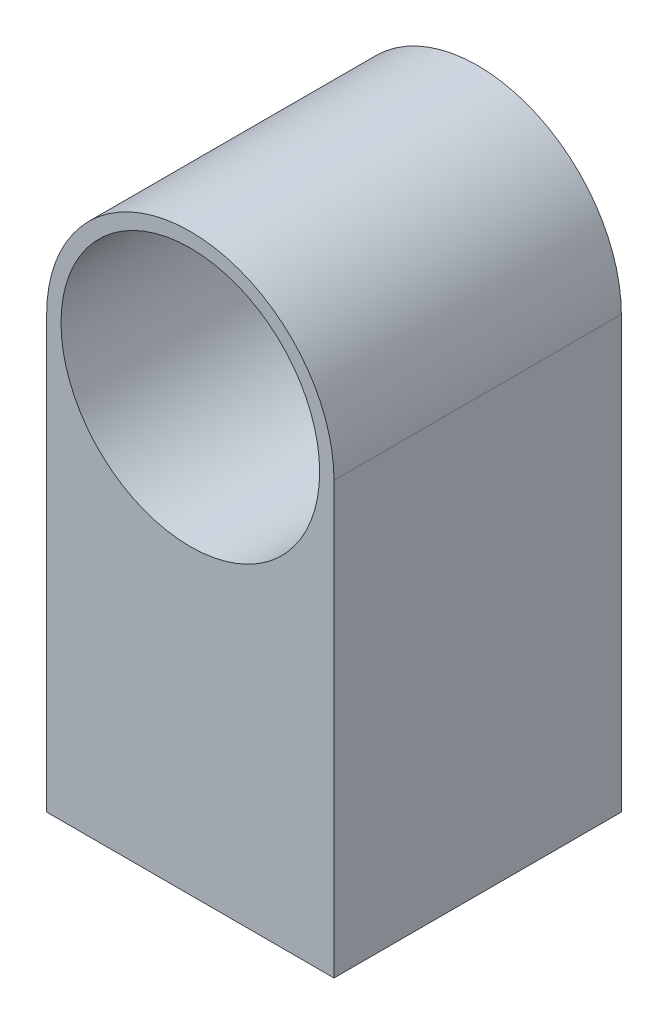
ISO-10303-21;
HEADER;
FILE_DESCRIPTION(('STEP AP214'),'2;1');
FILE_NAME('part.step','',(''),(''),'','','');
FILE_SCHEMA(('AUTOMOTIVE_DESIGN { 1 0 10303 214 1 1 1 1 }'));
ENDSEC;
DATA;
#1=APPLICATION_CONTEXT('core data for automotive mechanical design processes');
#2=APPLICATION_PROTOCOL_DEFINITION('international standard','automotive_design',2000,#1);
#3=PRODUCT_CONTEXT('',#1,'mechanical');
#4=PRODUCT('Part','Part','',(#3));
#5=PRODUCT_RELATED_PRODUCT_CATEGORY('part','',(#4));
#6=PRODUCT_DEFINITION_FORMATION('','',#4);
#7=PRODUCT_DEFINITION_CONTEXT('part definition',#1,'design');
#8=PRODUCT_DEFINITION('design','',#6,#7);
#9=PRODUCT_DEFINITION_SHAPE('','',#8);
#10=(LENGTH_UNIT() NAMED_UNIT(*) SI_UNIT(.MILLI.,.METRE.));
#11=(NAMED_UNIT(*) PLANE_ANGLE_UNIT() SI_UNIT($,.RADIAN.));
#12=(NAMED_UNIT(*) SI_UNIT($,.STERADIAN.) SOLID_ANGLE_UNIT());
#13=UNCERTAINTY_MEASURE_WITH_UNIT(LENGTH_MEASURE(1.E-05),#10,'distance_accuracy_value','');
#14=(GEOMETRIC_REPRESENTATION_CONTEXT(3) GLOBAL_UNCERTAINTY_ASSIGNED_CONTEXT((#13)) GLOBAL_UNIT_ASSIGNED_CONTEXT((#10,
#11,#12)) REPRESENTATION_CONTEXT('',''));
#15=CARTESIAN_POINT('',(0.,0.,0.));
#16=DIRECTION('',(0.,0.,1.));
#17=DIRECTION('',(1.,0.,0.));
#18=AXIS2_PLACEMENT_3D('',#15,#16,#17);
#19=CARTESIAN_POINT('',(50.,0.,100.));
#20=DIRECTION('',(0.,0.,-1.));
#21=DIRECTION('',(-1.,0.,0.));
#22=AXIS2_PLACEMENT_3D('',#19,#20,#21);
#23=PLANE('',#22);
#24=CARTESIAN_POINT('',(50.,0.,100.));
#25=DIRECTION('',(0.,0.,1.));
#26=DIRECTION('',(-1.,0.,0.));
#27=AXIS2_PLACEMENT_3D('',#24,#25,#26);
#28=CIRCLE('',#27,50.);
#29=CARTESIAN_POINT('',(100.,0.,100.));
#30=VERTEX_POINT('',#29);
#31=CARTESIAN_POINT('',(0.,0.,100.));
#32=VERTEX_POINT('',#31);
#33=EDGE_CURVE('E92',#30,#32,#28,.T.);
#34=ORIENTED_EDGE('',*,*,#33,.T.);
#35=DIRECTION('',(0.,-1.,0.));
#36=VECTOR('',#35,1.);
#37=CARTESIAN_POINT('',(0.,0.,100.));
#38=LINE('',#37,#36);
#39=CARTESIAN_POINT('',(0.,-150.,100.));
#40=VERTEX_POINT('',#39);
#41=EDGE_CURVE('E87',#32,#40,#38,.T.);
#42=ORIENTED_EDGE('',*,*,#41,.T.);
#43=DIRECTION('',(1.,0.,0.));
#44=VECTOR('',#43,1.);
#45=CARTESIAN_POINT('',(0.,-150.,100.));
#46=LINE('',#45,#44);
#47=CARTESIAN_POINT('',(100.,-150.,100.));
#48=VERTEX_POINT('',#47);
#49=EDGE_CURVE('E90',#40,#48,#46,.T.);
#50=ORIENTED_EDGE('',*,*,#49,.T.);
#51=DIRECTION('',(0.,1.,0.));
#52=VECTOR('',#51,1.);
#53=CARTESIAN_POINT('',(100.,0.,100.));
#54=LINE('',#53,#52);
#55=EDGE_CURVE('E57',#48,#30,#54,.T.);
#56=ORIENTED_EDGE('',*,*,#55,.T.);
#57=EDGE_LOOP('',(#34,#42,#50,#56));
#58=FACE_BOUND('',#57,.T.);
#59=CARTESIAN_POINT('',(50.,0.,100.));
#60=DIRECTION('',(0.,0.,1.));
#61=DIRECTION('',(1.,0.,0.));
#62=AXIS2_PLACEMENT_3D('',#59,#60,#61);
#63=CIRCLE('',#62,45.);
#64=CARTESIAN_POINT('',(95.,0.,100.));
#65=VERTEX_POINT('',#64);
#66=EDGE_CURVE('E112',#65,#65,#63,.T.);
#67=ORIENTED_EDGE('',*,*,#66,.F.);
#68=EDGE_LOOP('',(#67));
#69=FACE_BOUND('',#68,.T.);
#70=ADVANCED_FACE('F39',(#58,#69),#23,.F.);
#71=CARTESIAN_POINT('',(50.,0.,0.));
#72=DIRECTION('',(0.,0.,-1.));
#73=DIRECTION('',(-1.,0.,0.));
#74=AXIS2_PLACEMENT_3D('',#71,#72,#73);
#75=PLANE('',#74);
#76=CARTESIAN_POINT('',(50.,0.,0.));
#77=DIRECTION('',(0.,0.,1.));
#78=DIRECTION('',(-1.,0.,0.));
#79=AXIS2_PLACEMENT_3D('',#76,#77,#78);
#80=CIRCLE('',#79,50.);
#81=CARTESIAN_POINT('',(100.,0.,0.));
#82=VERTEX_POINT('',#81);
#83=CARTESIAN_POINT('',(0.,0.,0.));
#84=VERTEX_POINT('',#83);
#85=EDGE_CURVE('E108',#82,#84,#80,.T.);
#86=ORIENTED_EDGE('',*,*,#85,.F.);
#87=DIRECTION('',(0.,1.,0.));
#88=VECTOR('',#87,1.);
#89=CARTESIAN_POINT('',(100.,0.,0.));
#90=LINE('',#89,#88);
#91=CARTESIAN_POINT('',(100.,-150.,0.));
#92=VERTEX_POINT('',#91);
#93=EDGE_CURVE('E80',#92,#82,#90,.T.);
#94=ORIENTED_EDGE('',*,*,#93,.F.);
#95=DIRECTION('',(1.,0.,0.));
#96=VECTOR('',#95,1.);
#97=CARTESIAN_POINT('',(0.,-150.,0.));
#98=LINE('',#97,#96);
#99=CARTESIAN_POINT('',(0.,-150.,0.));
#100=VERTEX_POINT('',#99);
#101=EDGE_CURVE('E74',#100,#92,#98,.T.);
#102=ORIENTED_EDGE('',*,*,#101,.F.);
#103=DIRECTION('',(0.,-1.,0.));
#104=VECTOR('',#103,1.);
#105=CARTESIAN_POINT('',(0.,0.,0.));
#106=LINE('',#105,#104);
#107=EDGE_CURVE('E97',#84,#100,#106,.T.);
#108=ORIENTED_EDGE('',*,*,#107,.F.);
#109=EDGE_LOOP('',(#86,#94,#102,#108));
#110=FACE_BOUND('',#109,.T.);
#111=CARTESIAN_POINT('',(50.,0.,0.));
#112=DIRECTION('',(0.,0.,1.));
#113=DIRECTION('',(1.,0.,0.));
#114=AXIS2_PLACEMENT_3D('',#111,#112,#113);
#115=CIRCLE('',#114,45.);
#116=CARTESIAN_POINT('',(95.,0.,0.));
#117=VERTEX_POINT('',#116);
#118=EDGE_CURVE('E130',#117,#117,#115,.T.);
#119=ORIENTED_EDGE('',*,*,#118,.T.);
#120=EDGE_LOOP('',(#119));
#121=FACE_BOUND('',#120,.T.);
#122=ADVANCED_FACE('F125',(#110,#121),#75,.T.);
#123=CARTESIAN_POINT('',(50.,0.,100.));
#124=DIRECTION('',(0.,0.,-1.));
#125=DIRECTION('',(-1.,0.,0.));
#126=AXIS2_PLACEMENT_3D('',#123,#124,#125);
#127=CYLINDRICAL_SURFACE('',#126,50.);
#128=ORIENTED_EDGE('',*,*,#85,.T.);
#129=DIRECTION('',(0.,0.,-1.));
#130=VECTOR('',#129,1.);
#131=CARTESIAN_POINT('',(0.,0.,100.));
#132=LINE('',#131,#130);
#133=EDGE_CURVE('E11',#32,#84,#132,.T.);
#134=ORIENTED_EDGE('',*,*,#133,.F.);
#135=ORIENTED_EDGE('',*,*,#33,.F.);
#136=DIRECTION('',(0.,0.,-1.));
#137=VECTOR('',#136,1.);
#138=CARTESIAN_POINT('',(100.,0.,100.));
#139=LINE('',#138,#137);
#140=EDGE_CURVE('E104',#30,#82,#139,.T.);
#141=ORIENTED_EDGE('',*,*,#140,.T.);
#142=EDGE_LOOP('',(#128,#134,#135,#141));
#143=FACE_BOUND('',#142,.T.);
#144=ADVANCED_FACE('F41',(#143),#127,.T.);
#145=CARTESIAN_POINT('',(0.,0.,100.));
#146=DIRECTION('',(1.,0.,0.));
#147=DIRECTION('',(0.,0.,-1.));
#148=AXIS2_PLACEMENT_3D('',#145,#146,#147);
#149=PLANE('',#148);
#150=ORIENTED_EDGE('',*,*,#107,.T.);
#151=DIRECTION('',(0.,0.,-1.));
#152=VECTOR('',#151,1.);
#153=CARTESIAN_POINT('',(0.,-150.,100.));
#154=LINE('',#153,#152);
#155=EDGE_CURVE('E49',#40,#100,#154,.T.);
#156=ORIENTED_EDGE('',*,*,#155,.F.);
#157=ORIENTED_EDGE('',*,*,#41,.F.);
#158=ORIENTED_EDGE('',*,*,#133,.T.);
#159=EDGE_LOOP('',(#150,#156,#157,#158));
#160=FACE_BOUND('',#159,.T.);
#161=ADVANCED_FACE('F96',(#160),#149,.F.);
#162=CARTESIAN_POINT('',(0.,-150.,100.));
#163=DIRECTION('',(0.,1.,0.));
#164=DIRECTION('',(0.,0.,1.));
#165=AXIS2_PLACEMENT_3D('',#162,#163,#164);
#166=PLANE('',#165);
#167=ORIENTED_EDGE('',*,*,#101,.T.);
#168=DIRECTION('',(0.,0.,-1.));
#169=VECTOR('',#168,1.);
#170=CARTESIAN_POINT('',(100.,-150.,100.));
#171=LINE('',#170,#169);
#172=EDGE_CURVE('E99',#48,#92,#171,.T.);
#173=ORIENTED_EDGE('',*,*,#172,.F.);
#174=ORIENTED_EDGE('',*,*,#49,.F.);
#175=ORIENTED_EDGE('',*,*,#155,.T.);
#176=EDGE_LOOP('',(#167,#173,#174,#175));
#177=FACE_BOUND('',#176,.T.);
#178=ADVANCED_FACE('F100',(#177),#166,.F.);
#179=CARTESIAN_POINT('',(100.,0.,100.));
#180=DIRECTION('',(-1.,0.,0.));
#181=DIRECTION('',(0.,-1.,0.));
#182=AXIS2_PLACEMENT_3D('',#179,#180,#181);
#183=PLANE('',#182);
#184=ORIENTED_EDGE('',*,*,#93,.T.);
#185=ORIENTED_EDGE('',*,*,#140,.F.);
#186=ORIENTED_EDGE('',*,*,#55,.F.);
#187=ORIENTED_EDGE('',*,*,#172,.T.);
#188=EDGE_LOOP('',(#184,#185,#186,#187));
#189=FACE_BOUND('',#188,.T.);
#190=ADVANCED_FACE('F122',(#189),#183,.F.);
#191=CARTESIAN_POINT('',(50.,0.,100.));
#192=DIRECTION('',(0.,0.,-1.));
#193=DIRECTION('',(-1.,0.,0.));
#194=AXIS2_PLACEMENT_3D('',#191,#192,#193);
#195=CYLINDRICAL_SURFACE('',#194,45.);
#196=ORIENTED_EDGE('',*,*,#66,.T.);
#197=EDGE_LOOP('',(#196));
#198=FACE_BOUND('',#197,.T.);
#199=ORIENTED_EDGE('',*,*,#118,.F.);
#200=EDGE_LOOP('',(#199));
#201=FACE_BOUND('',#200,.T.);
#202=ADVANCED_FACE('F138',(#198,#201),#195,.F.);
#203=CLOSED_SHELL('',(#70,#122,#144,#161,#178,#190,#202));
#204=MANIFOLD_SOLID_BREP('B2',#203);
#205=ADVANCED_BREP_SHAPE_REPRESENTATION('',(#18,#204),#14);
#206=SHAPE_DEFINITION_REPRESENTATION(#9,#205);
ENDSEC;
END-ISO-10303-21;
